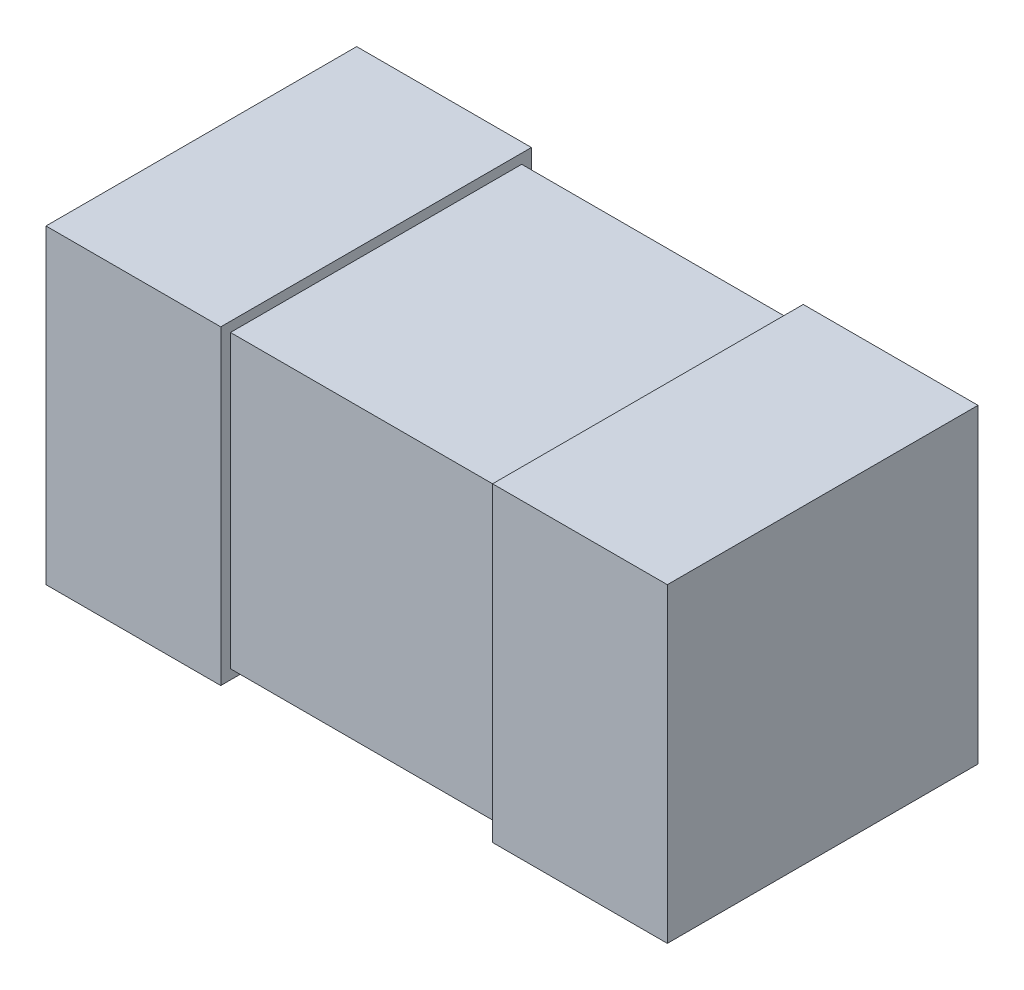
ISO-10303-21;
HEADER;
FILE_DESCRIPTION(('STEP AP214'),'2;1');
FILE_NAME('part.step','',(''),(''),'','','');
FILE_SCHEMA(('AUTOMOTIVE_DESIGN { 1 0 10303 214 1 1 1 1 }'));
ENDSEC;
DATA;
#1=APPLICATION_CONTEXT('core data for automotive mechanical design processes');
#2=APPLICATION_PROTOCOL_DEFINITION('international standard','automotive_design',2000,#1);
#3=PRODUCT_CONTEXT('',#1,'mechanical');
#4=PRODUCT('Part','Part','',(#3));
#5=PRODUCT_RELATED_PRODUCT_CATEGORY('part','',(#4));
#6=PRODUCT_DEFINITION_FORMATION('','',#4);
#7=PRODUCT_DEFINITION_CONTEXT('part definition',#1,'design');
#8=PRODUCT_DEFINITION('design','',#6,#7);
#9=PRODUCT_DEFINITION_SHAPE('','',#8);
#10=(LENGTH_UNIT() NAMED_UNIT(*) SI_UNIT(.MILLI.,.METRE.));
#11=(NAMED_UNIT(*) PLANE_ANGLE_UNIT() SI_UNIT($,.RADIAN.));
#12=(NAMED_UNIT(*) SI_UNIT($,.STERADIAN.) SOLID_ANGLE_UNIT());
#13=UNCERTAINTY_MEASURE_WITH_UNIT(LENGTH_MEASURE(1.E-05),#10,'distance_accuracy_value','');
#14=(GEOMETRIC_REPRESENTATION_CONTEXT(3) GLOBAL_UNCERTAINTY_ASSIGNED_CONTEXT((#13)) GLOBAL_UNIT_ASSIGNED_CONTEXT((#10,
#11,#12)) REPRESENTATION_CONTEXT('',''));
#15=CARTESIAN_POINT('',(0.,0.,0.));
#16=DIRECTION('',(0.,0.,1.));
#17=DIRECTION('',(1.,0.,0.));
#18=AXIS2_PLACEMENT_3D('',#15,#16,#17);
#19=CARTESIAN_POINT('',(0.9,1.6,0.));
#20=DIRECTION('',(-1.,0.,0.));
#21=DIRECTION('',(0.,0.,1.));
#22=AXIS2_PLACEMENT_3D('',#19,#20,#21);
#23=PLANE('',#22);
#24=DIRECTION('',(0.,0.,-1.));
#25=VECTOR('',#24,1.);
#26=CARTESIAN_POINT('',(0.9,0.,0.));
#27=LINE('',#26,#25);
#28=CARTESIAN_POINT('',(0.9,0.,0.));
#29=VERTEX_POINT('',#28);
#30=CARTESIAN_POINT('',(0.9,0.,-1.6));
#31=VERTEX_POINT('',#30);
#32=EDGE_CURVE('E197',#29,#31,#27,.T.);
#33=ORIENTED_EDGE('',*,*,#32,.T.);
#34=DIRECTION('',(0.,-1.,0.));
#35=VECTOR('',#34,1.);
#36=CARTESIAN_POINT('',(0.9,1.6,-1.6));
#37=LINE('',#36,#35);
#38=CARTESIAN_POINT('',(0.9,1.6,-1.6));
#39=VERTEX_POINT('',#38);
#40=EDGE_CURVE('E202',#39,#31,#37,.T.);
#41=ORIENTED_EDGE('',*,*,#40,.F.);
#42=DIRECTION('',(0.,0.,-1.));
#43=VECTOR('',#42,1.);
#44=CARTESIAN_POINT('',(0.9,1.6,0.));
#45=LINE('',#44,#43);
#46=CARTESIAN_POINT('',(0.9,1.6,0.));
#47=VERTEX_POINT('',#46);
#48=EDGE_CURVE('E188',#47,#39,#45,.T.);
#49=ORIENTED_EDGE('',*,*,#48,.F.);
#50=DIRECTION('',(0.,-1.,0.));
#51=VECTOR('',#50,1.);
#52=CARTESIAN_POINT('',(0.9,1.6,0.));
#53=LINE('',#52,#51);
#54=EDGE_CURVE('E40',#47,#29,#53,.T.);
#55=ORIENTED_EDGE('',*,*,#54,.T.);
#56=EDGE_LOOP('',(#33,#41,#49,#55));
#57=FACE_BOUND('',#56,.T.);
#58=DIRECTION('',(0.,-1.,0.));
#59=VECTOR('',#58,1.);
#60=CARTESIAN_POINT('',(0.9,1.55,-0.05));
#61=LINE('',#60,#59);
#62=CARTESIAN_POINT('',(0.9,1.55,-0.05));
#63=VERTEX_POINT('',#62);
#64=CARTESIAN_POINT('',(0.9,0.0500000000000003,-0.0500000000000002));
#65=VERTEX_POINT('',#64);
#66=EDGE_CURVE('E160',#63,#65,#61,.T.);
#67=ORIENTED_EDGE('',*,*,#66,.F.);
#68=DIRECTION('',(0.,0.,1.));
#69=VECTOR('',#68,1.);
#70=CARTESIAN_POINT('',(0.9,1.55,-0.05));
#71=LINE('',#70,#69);
#72=CARTESIAN_POINT('',(0.9,1.55,-1.55));
#73=VERTEX_POINT('',#72);
#74=EDGE_CURVE('E156',#73,#63,#71,.T.);
#75=ORIENTED_EDGE('',*,*,#74,.F.);
#76=DIRECTION('',(0.,1.,0.));
#77=VECTOR('',#76,1.);
#78=CARTESIAN_POINT('',(0.9,1.55,-1.55));
#79=LINE('',#78,#77);
#80=CARTESIAN_POINT('',(0.9,0.0500000000000003,-1.55));
#81=VERTEX_POINT('',#80);
#82=EDGE_CURVE('E52',#81,#73,#79,.T.);
#83=ORIENTED_EDGE('',*,*,#82,.F.);
#84=DIRECTION('',(0.,0.,-1.));
#85=VECTOR('',#84,1.);
#86=CARTESIAN_POINT('',(0.9,0.0500000000000003,-0.0500000000000002));
#87=LINE('',#86,#85);
#88=EDGE_CURVE('E47',#65,#81,#87,.T.);
#89=ORIENTED_EDGE('',*,*,#88,.F.);
#90=EDGE_LOOP('',(#67,#75,#83,#89));
#91=FACE_BOUND('',#90,.T.);
#92=ADVANCED_FACE('F32',(#57,#91),#23,.F.);
#93=CARTESIAN_POINT('',(0.,1.6,0.));
#94=DIRECTION('',(1.,0.,0.));
#95=DIRECTION('',(0.,0.,-1.));
#96=AXIS2_PLACEMENT_3D('',#93,#94,#95);
#97=PLANE('',#96);
#98=DIRECTION('',(0.,0.,1.));
#99=VECTOR('',#98,1.);
#100=CARTESIAN_POINT('',(0.,0.,0.));
#101=LINE('',#100,#99);
#102=CARTESIAN_POINT('',(0.,0.,-1.6));
#103=VERTEX_POINT('',#102);
#104=CARTESIAN_POINT('',(0.,0.,0.));
#105=VERTEX_POINT('',#104);
#106=EDGE_CURVE('E163',#103,#105,#101,.T.);
#107=ORIENTED_EDGE('',*,*,#106,.T.);
#108=DIRECTION('',(0.,-1.,0.));
#109=VECTOR('',#108,1.);
#110=CARTESIAN_POINT('',(0.,1.6,0.));
#111=LINE('',#110,#109);
#112=CARTESIAN_POINT('',(0.,1.6,0.));
#113=VERTEX_POINT('',#112);
#114=EDGE_CURVE('E11',#113,#105,#111,.T.);
#115=ORIENTED_EDGE('',*,*,#114,.F.);
#116=DIRECTION('',(0.,0.,1.));
#117=VECTOR('',#116,1.);
#118=CARTESIAN_POINT('',(0.,1.6,0.));
#119=LINE('',#118,#117);
#120=CARTESIAN_POINT('',(0.,1.6,-1.6));
#121=VERTEX_POINT('',#120);
#122=EDGE_CURVE('E182',#121,#113,#119,.T.);
#123=ORIENTED_EDGE('',*,*,#122,.F.);
#124=DIRECTION('',(0.,-1.,0.));
#125=VECTOR('',#124,1.);
#126=CARTESIAN_POINT('',(0.,1.6,-1.6));
#127=LINE('',#126,#125);
#128=EDGE_CURVE('E192',#121,#103,#127,.T.);
#129=ORIENTED_EDGE('',*,*,#128,.T.);
#130=EDGE_LOOP('',(#107,#115,#123,#129));
#131=FACE_BOUND('',#130,.T.);
#132=ADVANCED_FACE('F34',(#131),#97,.F.);
#133=CARTESIAN_POINT('',(0.,1.6,0.));
#134=DIRECTION('',(0.,0.,-1.));
#135=DIRECTION('',(-1.,0.,0.));
#136=AXIS2_PLACEMENT_3D('',#133,#134,#135);
#137=PLANE('',#136);
#138=DIRECTION('',(1.,0.,0.));
#139=VECTOR('',#138,1.);
#140=CARTESIAN_POINT('',(0.,0.,0.));
#141=LINE('',#140,#139);
#142=EDGE_CURVE('E195',#105,#29,#141,.T.);
#143=ORIENTED_EDGE('',*,*,#142,.T.);
#144=ORIENTED_EDGE('',*,*,#54,.F.);
#145=DIRECTION('',(1.,0.,0.));
#146=VECTOR('',#145,1.);
#147=CARTESIAN_POINT('',(0.,1.6,0.));
#148=LINE('',#147,#146);
#149=EDGE_CURVE('E185',#113,#47,#148,.T.);
#150=ORIENTED_EDGE('',*,*,#149,.F.);
#151=ORIENTED_EDGE('',*,*,#114,.T.);
#152=EDGE_LOOP('',(#143,#144,#150,#151));
#153=FACE_BOUND('',#152,.T.);
#154=ADVANCED_FACE('F224',(#153),#137,.F.);
#155=CARTESIAN_POINT('',(0.,1.6,-1.6));
#156=DIRECTION('',(0.,0.,1.));
#157=DIRECTION('',(1.,0.,0.));
#158=AXIS2_PLACEMENT_3D('',#155,#156,#157);
#159=PLANE('',#158);
#160=DIRECTION('',(-1.,0.,0.));
#161=VECTOR('',#160,1.);
#162=CARTESIAN_POINT('',(0.,0.,-1.6));
#163=LINE('',#162,#161);
#164=EDGE_CURVE('E186',#31,#103,#163,.T.);
#165=ORIENTED_EDGE('',*,*,#164,.T.);
#166=ORIENTED_EDGE('',*,*,#128,.F.);
#167=DIRECTION('',(-1.,0.,0.));
#168=VECTOR('',#167,1.);
#169=CARTESIAN_POINT('',(0.,1.6,-1.6));
#170=LINE('',#169,#168);
#171=EDGE_CURVE('E190',#39,#121,#170,.T.);
#172=ORIENTED_EDGE('',*,*,#171,.F.);
#173=ORIENTED_EDGE('',*,*,#40,.T.);
#174=EDGE_LOOP('',(#165,#166,#172,#173));
#175=FACE_BOUND('',#174,.T.);
#176=ADVANCED_FACE('F217',(#175),#159,.F.);
#177=CARTESIAN_POINT('',(0.,1.6,0.));
#178=DIRECTION('',(0.,-1.,0.));
#179=DIRECTION('',(0.,0.,-1.));
#180=AXIS2_PLACEMENT_3D('',#177,#178,#179);
#181=PLANE('',#180);
#182=ORIENTED_EDGE('',*,*,#122,.T.);
#183=ORIENTED_EDGE('',*,*,#149,.T.);
#184=ORIENTED_EDGE('',*,*,#48,.T.);
#185=ORIENTED_EDGE('',*,*,#171,.T.);
#186=EDGE_LOOP('',(#182,#183,#184,#185));
#187=FACE_BOUND('',#186,.T.);
#188=ADVANCED_FACE('F223',(#187),#181,.F.);
#189=CARTESIAN_POINT('',(0.,0.,0.));
#190=DIRECTION('',(0.,-1.,0.));
#191=DIRECTION('',(0.,0.,-1.));
#192=AXIS2_PLACEMENT_3D('',#189,#190,#191);
#193=PLANE('',#192);
#194=ORIENTED_EDGE('',*,*,#106,.F.);
#195=ORIENTED_EDGE('',*,*,#164,.F.);
#196=ORIENTED_EDGE('',*,*,#32,.F.);
#197=ORIENTED_EDGE('',*,*,#142,.F.);
#198=EDGE_LOOP('',(#194,#195,#196,#197));
#199=FACE_BOUND('',#198,.T.);
#200=ADVANCED_FACE('F214',(#199),#193,.T.);
#201=CARTESIAN_POINT('',(500000.,1.55,-0.05));
#202=DIRECTION('',(0.,0.,-1.));
#203=DIRECTION('',(0.,1.,0.));
#204=AXIS2_PLACEMENT_3D('',#201,#202,#203);
#205=PLANE('',#204);
#206=DIRECTION('',(0.,-1.,0.));
#207=VECTOR('',#206,1.);
#208=CARTESIAN_POINT('',(2.29999999999109,1.55,-0.05));
#209=LINE('',#208,#207);
#210=CARTESIAN_POINT('',(2.29999999999109,1.55,-0.05));
#211=VERTEX_POINT('',#210);
#212=CARTESIAN_POINT('',(2.30000000010477,0.0500000000000003,-0.0500000000000002));
#213=VERTEX_POINT('',#212);
#214=EDGE_CURVE('E168',#211,#213,#209,.T.);
#215=ORIENTED_EDGE('',*,*,#214,.F.);
#216=DIRECTION('',(-1.,0.,0.));
#217=VECTOR('',#216,1.);
#218=CARTESIAN_POINT('',(500000.,1.55,-0.05));
#219=LINE('',#218,#217);
#220=EDGE_CURVE('E159',#211,#63,#219,.T.);
#221=ORIENTED_EDGE('',*,*,#220,.T.);
#222=ORIENTED_EDGE('',*,*,#66,.T.);
#223=DIRECTION('',(-1.,0.,0.));
#224=VECTOR('',#223,1.);
#225=CARTESIAN_POINT('',(500000.,0.0500000000000003,-0.0500000000000002));
#226=LINE('',#225,#224);
#227=EDGE_CURVE('E165',#213,#65,#226,.T.);
#228=ORIENTED_EDGE('',*,*,#227,.F.);
#229=EDGE_LOOP('',(#215,#221,#222,#228));
#230=FACE_BOUND('',#229,.T.);
#231=ADVANCED_FACE('F238',(#230),#205,.F.);
#232=CARTESIAN_POINT('',(500000.,0.0500000000000003,-0.0500000000000002));
#233=DIRECTION('',(0.,1.,0.));
#234=DIRECTION('',(0.,0.,1.));
#235=AXIS2_PLACEMENT_3D('',#232,#233,#234);
#236=PLANE('',#235);
#237=DIRECTION('',(0.,0.,-1.));
#238=VECTOR('',#237,1.);
#239=CARTESIAN_POINT('',(2.29999999999109,0.0500000000000003,-0.0500000000000002));
#240=LINE('',#239,#238);
#241=CARTESIAN_POINT('',(2.30000000010477,0.0500000000000003,-1.55));
#242=VERTEX_POINT('',#241);
#243=EDGE_CURVE('E177',#213,#242,#240,.T.);
#244=ORIENTED_EDGE('',*,*,#243,.F.);
#245=ORIENTED_EDGE('',*,*,#227,.T.);
#246=ORIENTED_EDGE('',*,*,#88,.T.);
#247=DIRECTION('',(-1.,0.,0.));
#248=VECTOR('',#247,1.);
#249=CARTESIAN_POINT('',(500000.,0.0500000000000003,-1.55));
#250=LINE('',#249,#248);
#251=EDGE_CURVE('E167',#242,#81,#250,.T.);
#252=ORIENTED_EDGE('',*,*,#251,.F.);
#253=EDGE_LOOP('',(#244,#245,#246,#252));
#254=FACE_BOUND('',#253,.T.);
#255=ADVANCED_FACE('F248',(#254),#236,.F.);
#256=CARTESIAN_POINT('',(500000.,1.55,-1.55));
#257=DIRECTION('',(0.,0.,1.));
#258=DIRECTION('',(0.,-1.,0.));
#259=AXIS2_PLACEMENT_3D('',#256,#257,#258);
#260=PLANE('',#259);
#261=DIRECTION('',(0.,1.,0.));
#262=VECTOR('',#261,1.);
#263=CARTESIAN_POINT('',(2.29999999999109,1.55,-1.55));
#264=LINE('',#263,#262);
#265=CARTESIAN_POINT('',(2.30000000010477,1.55,-1.55));
#266=VERTEX_POINT('',#265);
#267=EDGE_CURVE('E149',#242,#266,#264,.T.);
#268=ORIENTED_EDGE('',*,*,#267,.F.);
#269=ORIENTED_EDGE('',*,*,#251,.T.);
#270=ORIENTED_EDGE('',*,*,#82,.T.);
#271=DIRECTION('',(-1.,0.,0.));
#272=VECTOR('',#271,1.);
#273=CARTESIAN_POINT('',(500000.,1.55,-1.55));
#274=LINE('',#273,#272);
#275=EDGE_CURVE('E170',#266,#73,#274,.T.);
#276=ORIENTED_EDGE('',*,*,#275,.F.);
#277=EDGE_LOOP('',(#268,#269,#270,#276));
#278=FACE_BOUND('',#277,.T.);
#279=ADVANCED_FACE('F244',(#278),#260,.F.);
#280=CARTESIAN_POINT('',(500000.,1.55,-0.05));
#281=DIRECTION('',(0.,-1.,0.));
#282=DIRECTION('',(0.,0.,-1.));
#283=AXIS2_PLACEMENT_3D('',#280,#281,#282);
#284=PLANE('',#283);
#285=DIRECTION('',(0.,0.,1.));
#286=VECTOR('',#285,1.);
#287=CARTESIAN_POINT('',(2.29999999999109,1.55,-0.05));
#288=LINE('',#287,#286);
#289=EDGE_CURVE('E146',#266,#211,#288,.T.);
#290=ORIENTED_EDGE('',*,*,#289,.F.);
#291=ORIENTED_EDGE('',*,*,#275,.T.);
#292=ORIENTED_EDGE('',*,*,#74,.T.);
#293=ORIENTED_EDGE('',*,*,#220,.F.);
#294=EDGE_LOOP('',(#290,#291,#292,#293));
#295=FACE_BOUND('',#294,.T.);
#296=ADVANCED_FACE('F239',(#295),#284,.F.);
#297=CARTESIAN_POINT('',(2.3,1.6,0.));
#298=DIRECTION('',(1.,0.,0.));
#299=DIRECTION('',(0.,0.,-1.));
#300=AXIS2_PLACEMENT_3D('',#297,#298,#299);
#301=PLANE('',#300);
#302=DIRECTION('',(0.,0.,1.));
#303=VECTOR('',#302,1.);
#304=CARTESIAN_POINT('',(2.3,0.,0.));
#305=LINE('',#304,#303);
#306=CARTESIAN_POINT('',(2.3,0.,-1.6));
#307=VERTEX_POINT('',#306);
#308=CARTESIAN_POINT('',(2.3,0.,0.));
#309=VERTEX_POINT('',#308);
#310=EDGE_CURVE('E145',#307,#309,#305,.T.);
#311=ORIENTED_EDGE('',*,*,#310,.T.);
#312=DIRECTION('',(0.,-1.,0.));
#313=VECTOR('',#312,1.);
#314=CARTESIAN_POINT('',(2.3,1.6,0.));
#315=LINE('',#314,#313);
#316=CARTESIAN_POINT('',(2.3,1.6,0.));
#317=VERTEX_POINT('',#316);
#318=EDGE_CURVE('E124',#317,#309,#315,.T.);
#319=ORIENTED_EDGE('',*,*,#318,.F.);
#320=DIRECTION('',(0.,0.,1.));
#321=VECTOR('',#320,1.);
#322=CARTESIAN_POINT('',(2.3,1.6,0.));
#323=LINE('',#322,#321);
#324=CARTESIAN_POINT('',(2.3,1.6,-1.6));
#325=VERTEX_POINT('',#324);
#326=EDGE_CURVE('E131',#325,#317,#323,.T.);
#327=ORIENTED_EDGE('',*,*,#326,.F.);
#328=DIRECTION('',(0.,-1.,0.));
#329=VECTOR('',#328,1.);
#330=CARTESIAN_POINT('',(2.3,1.6,-1.6));
#331=LINE('',#330,#329);
#332=EDGE_CURVE('E376',#325,#307,#331,.T.);
#333=ORIENTED_EDGE('',*,*,#332,.T.);
#334=EDGE_LOOP('',(#311,#319,#327,#333));
#335=FACE_BOUND('',#334,.T.);
#336=ORIENTED_EDGE('',*,*,#289,.T.);
#337=ORIENTED_EDGE('',*,*,#214,.T.);
#338=ORIENTED_EDGE('',*,*,#243,.T.);
#339=ORIENTED_EDGE('',*,*,#267,.T.);
#340=EDGE_LOOP('',(#336,#337,#338,#339));
#341=FACE_BOUND('',#340,.T.);
#342=ADVANCED_FACE('F142',(#335,#341),#301,.F.);
#343=CARTESIAN_POINT('',(2.3,1.6,0.));
#344=DIRECTION('',(0.,0.,-1.));
#345=DIRECTION('',(-1.,0.,0.));
#346=AXIS2_PLACEMENT_3D('',#343,#344,#345);
#347=PLANE('',#346);
#348=DIRECTION('',(1.,0.,0.));
#349=VECTOR('',#348,1.);
#350=CARTESIAN_POINT('',(2.3,0.,0.));
#351=LINE('',#350,#349);
#352=CARTESIAN_POINT('',(3.2,0.,0.));
#353=VERTEX_POINT('',#352);
#354=EDGE_CURVE('E367',#309,#353,#351,.T.);
#355=ORIENTED_EDGE('',*,*,#354,.T.);
#356=DIRECTION('',(0.,-1.,0.));
#357=VECTOR('',#356,1.);
#358=CARTESIAN_POINT('',(3.2,1.6,0.));
#359=LINE('',#358,#357);
#360=CARTESIAN_POINT('',(3.2,1.6,0.));
#361=VERTEX_POINT('',#360);
#362=EDGE_CURVE('E127',#361,#353,#359,.T.);
#363=ORIENTED_EDGE('',*,*,#362,.F.);
#364=DIRECTION('',(1.,0.,0.));
#365=VECTOR('',#364,1.);
#366=CARTESIAN_POINT('',(2.3,1.6,0.));
#367=LINE('',#366,#365);
#368=EDGE_CURVE('E120',#317,#361,#367,.T.);
#369=ORIENTED_EDGE('',*,*,#368,.F.);
#370=ORIENTED_EDGE('',*,*,#318,.T.);
#371=EDGE_LOOP('',(#355,#363,#369,#370));
#372=FACE_BOUND('',#371,.T.);
#373=ADVANCED_FACE('F122',(#372),#347,.F.);
#374=CARTESIAN_POINT('',(3.2,1.6,0.));
#375=DIRECTION('',(-1.,0.,0.));
#376=DIRECTION('',(0.,0.,1.));
#377=AXIS2_PLACEMENT_3D('',#374,#375,#376);
#378=PLANE('',#377);
#379=DIRECTION('',(0.,0.,-1.));
#380=VECTOR('',#379,1.);
#381=CARTESIAN_POINT('',(3.2,0.,0.));
#382=LINE('',#381,#380);
#383=CARTESIAN_POINT('',(3.2,0.,-1.6));
#384=VERTEX_POINT('',#383);
#385=EDGE_CURVE('E369',#353,#384,#382,.T.);
#386=ORIENTED_EDGE('',*,*,#385,.T.);
#387=DIRECTION('',(0.,-1.,0.));
#388=VECTOR('',#387,1.);
#389=CARTESIAN_POINT('',(3.2,1.6,-1.6));
#390=LINE('',#389,#388);
#391=CARTESIAN_POINT('',(3.2,1.6,-1.6));
#392=VERTEX_POINT('',#391);
#393=EDGE_CURVE('E151',#392,#384,#390,.T.);
#394=ORIENTED_EDGE('',*,*,#393,.F.);
#395=DIRECTION('',(0.,0.,-1.));
#396=VECTOR('',#395,1.);
#397=CARTESIAN_POINT('',(3.2,1.6,0.));
#398=LINE('',#397,#396);
#399=EDGE_CURVE('E130',#361,#392,#398,.T.);
#400=ORIENTED_EDGE('',*,*,#399,.F.);
#401=ORIENTED_EDGE('',*,*,#362,.T.);
#402=EDGE_LOOP('',(#386,#394,#400,#401));
#403=FACE_BOUND('',#402,.T.);
#404=ADVANCED_FACE('F260',(#403),#378,.F.);
#405=CARTESIAN_POINT('',(2.3,1.6,-1.6));
#406=DIRECTION('',(0.,0.,1.));
#407=DIRECTION('',(1.,0.,0.));
#408=AXIS2_PLACEMENT_3D('',#405,#406,#407);
#409=PLANE('',#408);
#410=DIRECTION('',(-1.,0.,0.));
#411=VECTOR('',#410,1.);
#412=CARTESIAN_POINT('',(2.3,0.,-1.6));
#413=LINE('',#412,#411);
#414=EDGE_CURVE('E140',#384,#307,#413,.T.);
#415=ORIENTED_EDGE('',*,*,#414,.T.);
#416=ORIENTED_EDGE('',*,*,#332,.F.);
#417=DIRECTION('',(-1.,0.,0.));
#418=VECTOR('',#417,1.);
#419=CARTESIAN_POINT('',(2.3,1.6,-1.6));
#420=LINE('',#419,#418);
#421=EDGE_CURVE('E136',#392,#325,#420,.T.);
#422=ORIENTED_EDGE('',*,*,#421,.F.);
#423=ORIENTED_EDGE('',*,*,#393,.T.);
#424=EDGE_LOOP('',(#415,#416,#422,#423));
#425=FACE_BOUND('',#424,.T.);
#426=ADVANCED_FACE('F263',(#425),#409,.F.);
#427=CARTESIAN_POINT('',(0.,1.6,0.));
#428=DIRECTION('',(0.,-1.,0.));
#429=DIRECTION('',(0.,0.,-1.));
#430=AXIS2_PLACEMENT_3D('',#427,#428,#429);
#431=PLANE('',#430);
#432=ORIENTED_EDGE('',*,*,#326,.T.);
#433=ORIENTED_EDGE('',*,*,#368,.T.);
#434=ORIENTED_EDGE('',*,*,#399,.T.);
#435=ORIENTED_EDGE('',*,*,#421,.T.);
#436=EDGE_LOOP('',(#432,#433,#434,#435));
#437=FACE_BOUND('',#436,.T.);
#438=ADVANCED_FACE('F134',(#437),#431,.F.);
#439=CARTESIAN_POINT('',(0.,0.,0.));
#440=DIRECTION('',(0.,-1.,0.));
#441=DIRECTION('',(0.,0.,-1.));
#442=AXIS2_PLACEMENT_3D('',#439,#440,#441);
#443=PLANE('',#442);
#444=ORIENTED_EDGE('',*,*,#310,.F.);
#445=ORIENTED_EDGE('',*,*,#414,.F.);
#446=ORIENTED_EDGE('',*,*,#385,.F.);
#447=ORIENTED_EDGE('',*,*,#354,.F.);
#448=EDGE_LOOP('',(#444,#445,#446,#447));
#449=FACE_BOUND('',#448,.T.);
#450=ADVANCED_FACE('F268',(#449),#443,.T.);
#451=CLOSED_SHELL('',(#92,#132,#154,#176,#188,#200,#231,#255,#279,#296,#342,#373,#404,#426,#438,#450));
#452=MANIFOLD_SOLID_BREP('B2',#451);
#453=ADVANCED_BREP_SHAPE_REPRESENTATION('',(#18,#452),#14);
#454=SHAPE_DEFINITION_REPRESENTATION(#9,#453);
ENDSEC;
END-ISO-10303-21;
